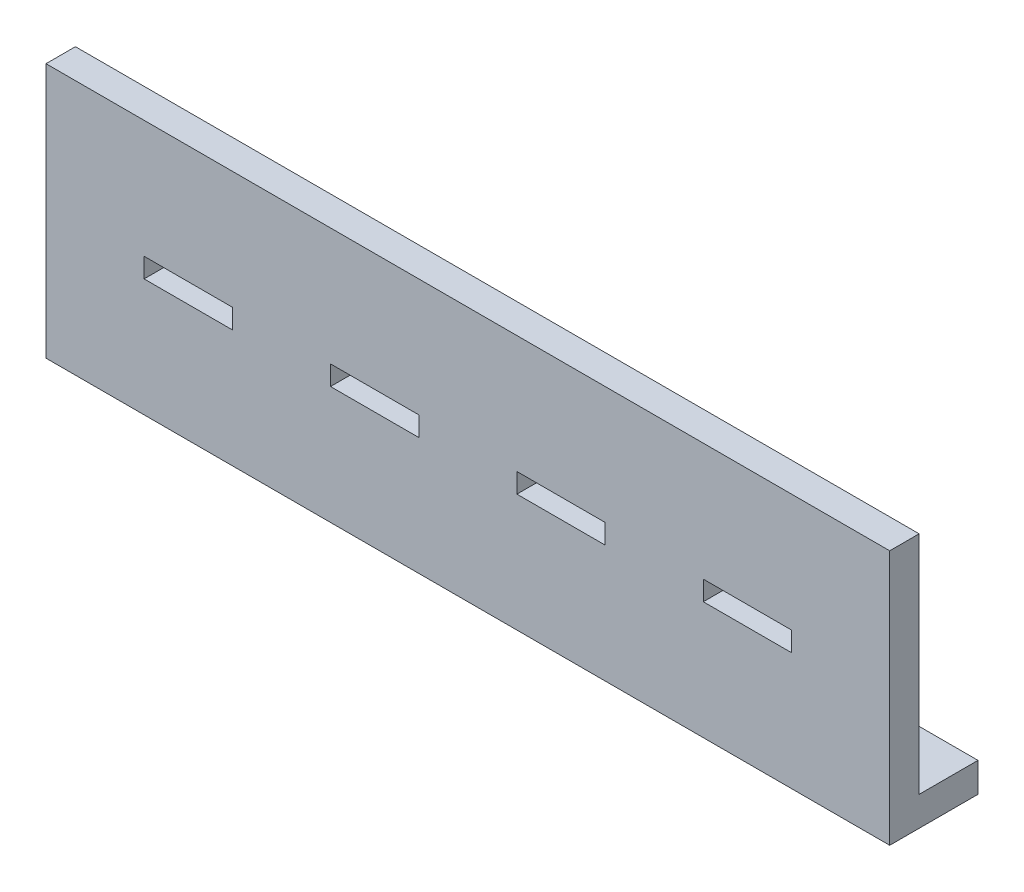
ISO-10303-21;
HEADER;
FILE_DESCRIPTION(('STEP AP214'),'2;1');
FILE_NAME('part.step','',(''),(''),'','','');
FILE_SCHEMA(('AUTOMOTIVE_DESIGN { 1 0 10303 214 1 1 1 1 }'));
ENDSEC;
DATA;
#1=APPLICATION_CONTEXT('core data for automotive mechanical design processes');
#2=APPLICATION_PROTOCOL_DEFINITION('international standard','automotive_design',2000,#1);
#3=PRODUCT_CONTEXT('',#1,'mechanical');
#4=PRODUCT('Part','Part','',(#3));
#5=PRODUCT_RELATED_PRODUCT_CATEGORY('part','',(#4));
#6=PRODUCT_DEFINITION_FORMATION('','',#4);
#7=PRODUCT_DEFINITION_CONTEXT('part definition',#1,'design');
#8=PRODUCT_DEFINITION('design','',#6,#7);
#9=PRODUCT_DEFINITION_SHAPE('','',#8);
#10=(LENGTH_UNIT() NAMED_UNIT(*) SI_UNIT(.MILLI.,.METRE.));
#11=(NAMED_UNIT(*) PLANE_ANGLE_UNIT() SI_UNIT($,.RADIAN.));
#12=(NAMED_UNIT(*) SI_UNIT($,.STERADIAN.) SOLID_ANGLE_UNIT());
#13=UNCERTAINTY_MEASURE_WITH_UNIT(LENGTH_MEASURE(1.E-05),#10,'distance_accuracy_value','');
#14=(GEOMETRIC_REPRESENTATION_CONTEXT(3) GLOBAL_UNCERTAINTY_ASSIGNED_CONTEXT((#13)) GLOBAL_UNIT_ASSIGNED_CONTEXT((#10,
#11,#12)) REPRESENTATION_CONTEXT('',''));
#15=CARTESIAN_POINT('',(0.,0.,0.));
#16=DIRECTION('',(0.,0.,1.));
#17=DIRECTION('',(1.,0.,0.));
#18=AXIS2_PLACEMENT_3D('',#15,#16,#17);
#19=CARTESIAN_POINT('',(0.,0.,1.5));
#20=DIRECTION('',(0.,0.,-1.));
#21=DIRECTION('',(-1.,0.,0.));
#22=AXIS2_PLACEMENT_3D('',#19,#20,#21);
#23=PLANE('',#22);
#24=DIRECTION('',(0.,-1.,0.));
#25=VECTOR('',#24,1.);
#26=CARTESIAN_POINT('',(48.,14.,1.5));
#27=LINE('',#26,#25);
#28=CARTESIAN_POINT('',(48.,14.,1.5));
#29=VERTEX_POINT('',#28);
#30=CARTESIAN_POINT('',(48.,12.,1.5));
#31=VERTEX_POINT('',#30);
#32=EDGE_CURVE('E240',#29,#31,#27,.T.);
#33=ORIENTED_EDGE('',*,*,#32,.F.);
#34=DIRECTION('',(-1.,0.,0.));
#35=VECTOR('',#34,1.);
#36=CARTESIAN_POINT('',(48.,14.,1.5));
#37=LINE('',#36,#35);
#38=CARTESIAN_POINT('',(57.,14.,1.5));
#39=VERTEX_POINT('',#38);
#40=EDGE_CURVE('E248',#39,#29,#37,.T.);
#41=ORIENTED_EDGE('',*,*,#40,.F.);
#42=DIRECTION('',(0.,1.,0.));
#43=VECTOR('',#42,1.);
#44=CARTESIAN_POINT('',(57.,14.,1.5));
#45=LINE('',#44,#43);
#46=CARTESIAN_POINT('',(57.,12.,1.5));
#47=VERTEX_POINT('',#46);
#48=EDGE_CURVE('E245',#47,#39,#45,.T.);
#49=ORIENTED_EDGE('',*,*,#48,.F.);
#50=DIRECTION('',(1.,0.,0.));
#51=VECTOR('',#50,1.);
#52=CARTESIAN_POINT('',(48.,12.,1.5));
#53=LINE('',#52,#51);
#54=EDGE_CURVE('E242',#31,#47,#53,.T.);
#55=ORIENTED_EDGE('',*,*,#54,.F.);
#56=EDGE_LOOP('',(#33,#41,#49,#55));
#57=FACE_BOUND('',#56,.T.);
#58=DIRECTION('',(0.,-1.,0.));
#59=VECTOR('',#58,1.);
#60=CARTESIAN_POINT('',(10.,14.,1.5));
#61=LINE('',#60,#59);
#62=CARTESIAN_POINT('',(10.,14.,1.5));
#63=VERTEX_POINT('',#62);
#64=CARTESIAN_POINT('',(10.,12.,1.5));
#65=VERTEX_POINT('',#64);
#66=EDGE_CURVE('E302',#63,#65,#61,.T.);
#67=ORIENTED_EDGE('',*,*,#66,.F.);
#68=DIRECTION('',(-1.,0.,0.));
#69=VECTOR('',#68,1.);
#70=CARTESIAN_POINT('',(10.,14.,1.5));
#71=LINE('',#70,#69);
#72=CARTESIAN_POINT('',(19.,14.,1.5));
#73=VERTEX_POINT('',#72);
#74=EDGE_CURVE('E310',#73,#63,#71,.T.);
#75=ORIENTED_EDGE('',*,*,#74,.F.);
#76=DIRECTION('',(0.,1.,0.));
#77=VECTOR('',#76,1.);
#78=CARTESIAN_POINT('',(19.,14.,1.5));
#79=LINE('',#78,#77);
#80=CARTESIAN_POINT('',(19.,12.,1.5));
#81=VERTEX_POINT('',#80);
#82=EDGE_CURVE('E307',#81,#73,#79,.T.);
#83=ORIENTED_EDGE('',*,*,#82,.F.);
#84=DIRECTION('',(1.,0.,0.));
#85=VECTOR('',#84,1.);
#86=CARTESIAN_POINT('',(10.,12.,1.5));
#87=LINE('',#86,#85);
#88=EDGE_CURVE('E304',#65,#81,#87,.T.);
#89=ORIENTED_EDGE('',*,*,#88,.F.);
#90=EDGE_LOOP('',(#67,#75,#83,#89));
#91=FACE_BOUND('',#90,.T.);
#92=DIRECTION('',(0.,-1.,0.));
#93=VECTOR('',#92,1.);
#94=CARTESIAN_POINT('',(0.,0.,1.5));
#95=LINE('',#94,#93);
#96=CARTESIAN_POINT('',(0.,26.,1.5));
#97=VERTEX_POINT('',#96);
#98=CARTESIAN_POINT('',(0.,0.,1.5));
#99=VERTEX_POINT('',#98);
#100=EDGE_CURVE('E333',#97,#99,#95,.T.);
#101=ORIENTED_EDGE('',*,*,#100,.T.);
#102=DIRECTION('',(1.,0.,0.));
#103=VECTOR('',#102,1.);
#104=CARTESIAN_POINT('',(0.,0.,1.5));
#105=LINE('',#104,#103);
#106=CARTESIAN_POINT('',(86.,0.,1.5));
#107=VERTEX_POINT('',#106);
#108=EDGE_CURVE('E336',#99,#107,#105,.T.);
#109=ORIENTED_EDGE('',*,*,#108,.T.);
#110=DIRECTION('',(0.,1.,0.));
#111=VECTOR('',#110,1.);
#112=CARTESIAN_POINT('',(86.,0.,1.5));
#113=LINE('',#112,#111);
#114=CARTESIAN_POINT('',(86.,26.,1.5));
#115=VERTEX_POINT('',#114);
#116=EDGE_CURVE('E339',#107,#115,#113,.T.);
#117=ORIENTED_EDGE('',*,*,#116,.T.);
#118=DIRECTION('',(-1.,0.,0.));
#119=VECTOR('',#118,1.);
#120=CARTESIAN_POINT('',(0.,26.,1.5));
#121=LINE('',#120,#119);
#122=EDGE_CURVE('E341',#115,#97,#121,.T.);
#123=ORIENTED_EDGE('',*,*,#122,.T.);
#124=EDGE_LOOP('',(#101,#109,#117,#123));
#125=FACE_BOUND('',#124,.T.);
#126=DIRECTION('',(0.,-1.,0.));
#127=VECTOR('',#126,1.);
#128=CARTESIAN_POINT('',(29.,14.,1.5));
#129=LINE('',#128,#127);
#130=CARTESIAN_POINT('',(29.,14.,1.5));
#131=VERTEX_POINT('',#130);
#132=CARTESIAN_POINT('',(29.,12.,1.5));
#133=VERTEX_POINT('',#132);
#134=EDGE_CURVE('E271',#131,#133,#129,.T.);
#135=ORIENTED_EDGE('',*,*,#134,.F.);
#136=DIRECTION('',(-1.,0.,0.));
#137=VECTOR('',#136,1.);
#138=CARTESIAN_POINT('',(29.,14.,1.5));
#139=LINE('',#138,#137);
#140=CARTESIAN_POINT('',(38.,14.,1.5));
#141=VERTEX_POINT('',#140);
#142=EDGE_CURVE('E279',#141,#131,#139,.T.);
#143=ORIENTED_EDGE('',*,*,#142,.F.);
#144=DIRECTION('',(0.,1.,0.));
#145=VECTOR('',#144,1.);
#146=CARTESIAN_POINT('',(38.,14.,1.5));
#147=LINE('',#146,#145);
#148=CARTESIAN_POINT('',(38.,12.,1.5));
#149=VERTEX_POINT('',#148);
#150=EDGE_CURVE('E276',#149,#141,#147,.T.);
#151=ORIENTED_EDGE('',*,*,#150,.F.);
#152=DIRECTION('',(1.,0.,0.));
#153=VECTOR('',#152,1.);
#154=CARTESIAN_POINT('',(29.,12.,1.5));
#155=LINE('',#154,#153);
#156=EDGE_CURVE('E273',#133,#149,#155,.T.);
#157=ORIENTED_EDGE('',*,*,#156,.F.);
#158=EDGE_LOOP('',(#135,#143,#151,#157));
#159=FACE_BOUND('',#158,.T.);
#160=DIRECTION('',(0.,-1.,0.));
#161=VECTOR('',#160,1.);
#162=CARTESIAN_POINT('',(67.,14.,1.5));
#163=LINE('',#162,#161);
#164=CARTESIAN_POINT('',(67.,14.,1.5));
#165=VERTEX_POINT('',#164);
#166=CARTESIAN_POINT('',(67.,12.,1.5));
#167=VERTEX_POINT('',#166);
#168=EDGE_CURVE('E214',#165,#167,#163,.T.);
#169=ORIENTED_EDGE('',*,*,#168,.F.);
#170=DIRECTION('',(-1.,0.,0.));
#171=VECTOR('',#170,1.);
#172=CARTESIAN_POINT('',(67.,14.,1.5));
#173=LINE('',#172,#171);
#174=CARTESIAN_POINT('',(76.,14.,1.5));
#175=VERTEX_POINT('',#174);
#176=EDGE_CURVE('E221',#175,#165,#173,.T.);
#177=ORIENTED_EDGE('',*,*,#176,.F.);
#178=DIRECTION('',(0.,1.,0.));
#179=VECTOR('',#178,1.);
#180=CARTESIAN_POINT('',(76.,14.,1.5));
#181=LINE('',#180,#179);
#182=CARTESIAN_POINT('',(76.,12.,1.5));
#183=VERTEX_POINT('',#182);
#184=EDGE_CURVE('E219',#183,#175,#181,.T.);
#185=ORIENTED_EDGE('',*,*,#184,.F.);
#186=DIRECTION('',(1.,0.,0.));
#187=VECTOR('',#186,1.);
#188=CARTESIAN_POINT('',(67.,12.,1.5));
#189=LINE('',#188,#187);
#190=EDGE_CURVE('E216',#167,#183,#189,.T.);
#191=ORIENTED_EDGE('',*,*,#190,.F.);
#192=EDGE_LOOP('',(#169,#177,#185,#191));
#193=FACE_BOUND('',#192,.T.);
#194=ADVANCED_FACE('F34',(#57,#91,#125,#159,#193),#23,.F.);
#195=CARTESIAN_POINT('',(0.,0.,-1.5));
#196=DIRECTION('',(0.,0.,-1.));
#197=DIRECTION('',(-1.,0.,0.));
#198=AXIS2_PLACEMENT_3D('',#195,#196,#197);
#199=PLANE('',#198);
#200=DIRECTION('',(1.,0.,0.));
#201=VECTOR('',#200,1.);
#202=CARTESIAN_POINT('',(0.,3.,-1.5));
#203=LINE('',#202,#201);
#204=CARTESIAN_POINT('',(0.,3.,-1.5));
#205=VERTEX_POINT('',#204);
#206=CARTESIAN_POINT('',(86.,3.,-1.5));
#207=VERTEX_POINT('',#206);
#208=EDGE_CURVE('E49',#205,#207,#203,.T.);
#209=ORIENTED_EDGE('',*,*,#208,.F.);
#210=DIRECTION('',(0.,-1.,0.));
#211=VECTOR('',#210,1.);
#212=CARTESIAN_POINT('',(0.,0.,-1.5));
#213=LINE('',#212,#211);
#214=CARTESIAN_POINT('',(0.,26.,-1.5));
#215=VERTEX_POINT('',#214);
#216=EDGE_CURVE('E332',#215,#205,#213,.T.);
#217=ORIENTED_EDGE('',*,*,#216,.F.);
#218=DIRECTION('',(-1.,0.,0.));
#219=VECTOR('',#218,1.);
#220=CARTESIAN_POINT('',(0.,26.,-1.5));
#221=LINE('',#220,#219);
#222=CARTESIAN_POINT('',(86.,26.,-1.5));
#223=VERTEX_POINT('',#222);
#224=EDGE_CURVE('E337',#223,#215,#221,.T.);
#225=ORIENTED_EDGE('',*,*,#224,.F.);
#226=DIRECTION('',(0.,1.,0.));
#227=VECTOR('',#226,1.);
#228=CARTESIAN_POINT('',(86.,0.,-1.5));
#229=LINE('',#228,#227);
#230=EDGE_CURVE('E345',#207,#223,#229,.T.);
#231=ORIENTED_EDGE('',*,*,#230,.F.);
#232=EDGE_LOOP('',(#209,#217,#225,#231));
#233=FACE_BOUND('',#232,.T.);
#234=DIRECTION('',(-1.,0.,0.));
#235=VECTOR('',#234,1.);
#236=CARTESIAN_POINT('',(10.,14.,-1.5));
#237=LINE('',#236,#235);
#238=CARTESIAN_POINT('',(19.,14.,-1.5));
#239=VERTEX_POINT('',#238);
#240=CARTESIAN_POINT('',(10.,14.,-1.5));
#241=VERTEX_POINT('',#240);
#242=EDGE_CURVE('E305',#239,#241,#237,.T.);
#243=ORIENTED_EDGE('',*,*,#242,.T.);
#244=DIRECTION('',(0.,-1.,0.));
#245=VECTOR('',#244,1.);
#246=CARTESIAN_POINT('',(10.,14.,-1.5));
#247=LINE('',#246,#245);
#248=CARTESIAN_POINT('',(10.,12.,-1.5));
#249=VERTEX_POINT('',#248);
#250=EDGE_CURVE('E301',#241,#249,#247,.T.);
#251=ORIENTED_EDGE('',*,*,#250,.T.);
#252=DIRECTION('',(1.,0.,0.));
#253=VECTOR('',#252,1.);
#254=CARTESIAN_POINT('',(10.,12.,-1.5));
#255=LINE('',#254,#253);
#256=CARTESIAN_POINT('',(19.,12.,-1.5));
#257=VERTEX_POINT('',#256);
#258=EDGE_CURVE('E315',#249,#257,#255,.T.);
#259=ORIENTED_EDGE('',*,*,#258,.T.);
#260=DIRECTION('',(0.,1.,0.));
#261=VECTOR('',#260,1.);
#262=CARTESIAN_POINT('',(19.,14.,-1.5));
#263=LINE('',#262,#261);
#264=EDGE_CURVE('E318',#257,#239,#263,.T.);
#265=ORIENTED_EDGE('',*,*,#264,.T.);
#266=EDGE_LOOP('',(#243,#251,#259,#265));
#267=FACE_BOUND('',#266,.T.);
#268=DIRECTION('',(-1.,0.,0.));
#269=VECTOR('',#268,1.);
#270=CARTESIAN_POINT('',(29.,14.,-1.5));
#271=LINE('',#270,#269);
#272=CARTESIAN_POINT('',(38.,14.,-1.5));
#273=VERTEX_POINT('',#272);
#274=CARTESIAN_POINT('',(29.,14.,-1.5));
#275=VERTEX_POINT('',#274);
#276=EDGE_CURVE('E274',#273,#275,#271,.T.);
#277=ORIENTED_EDGE('',*,*,#276,.T.);
#278=DIRECTION('',(0.,-1.,0.));
#279=VECTOR('',#278,1.);
#280=CARTESIAN_POINT('',(29.,14.,-1.5));
#281=LINE('',#280,#279);
#282=CARTESIAN_POINT('',(29.,12.,-1.5));
#283=VERTEX_POINT('',#282);
#284=EDGE_CURVE('E270',#275,#283,#281,.T.);
#285=ORIENTED_EDGE('',*,*,#284,.T.);
#286=DIRECTION('',(1.,0.,0.));
#287=VECTOR('',#286,1.);
#288=CARTESIAN_POINT('',(29.,12.,-1.5));
#289=LINE('',#288,#287);
#290=CARTESIAN_POINT('',(38.,12.,-1.5));
#291=VERTEX_POINT('',#290);
#292=EDGE_CURVE('E284',#283,#291,#289,.T.);
#293=ORIENTED_EDGE('',*,*,#292,.T.);
#294=DIRECTION('',(0.,1.,0.));
#295=VECTOR('',#294,1.);
#296=CARTESIAN_POINT('',(38.,14.,-1.5));
#297=LINE('',#296,#295);
#298=EDGE_CURVE('E287',#291,#273,#297,.T.);
#299=ORIENTED_EDGE('',*,*,#298,.T.);
#300=EDGE_LOOP('',(#277,#285,#293,#299));
#301=FACE_BOUND('',#300,.T.);
#302=DIRECTION('',(-1.,0.,0.));
#303=VECTOR('',#302,1.);
#304=CARTESIAN_POINT('',(48.,14.,-1.5));
#305=LINE('',#304,#303);
#306=CARTESIAN_POINT('',(57.,14.,-1.5));
#307=VERTEX_POINT('',#306);
#308=CARTESIAN_POINT('',(48.,14.,-1.5));
#309=VERTEX_POINT('',#308);
#310=EDGE_CURVE('E243',#307,#309,#305,.T.);
#311=ORIENTED_EDGE('',*,*,#310,.T.);
#312=DIRECTION('',(0.,-1.,0.));
#313=VECTOR('',#312,1.);
#314=CARTESIAN_POINT('',(48.,14.,-1.5));
#315=LINE('',#314,#313);
#316=CARTESIAN_POINT('',(48.,12.,-1.5));
#317=VERTEX_POINT('',#316);
#318=EDGE_CURVE('E239',#309,#317,#315,.T.);
#319=ORIENTED_EDGE('',*,*,#318,.T.);
#320=DIRECTION('',(1.,0.,0.));
#321=VECTOR('',#320,1.);
#322=CARTESIAN_POINT('',(48.,12.,-1.5));
#323=LINE('',#322,#321);
#324=CARTESIAN_POINT('',(57.,12.,-1.5));
#325=VERTEX_POINT('',#324);
#326=EDGE_CURVE('E253',#317,#325,#323,.T.);
#327=ORIENTED_EDGE('',*,*,#326,.T.);
#328=DIRECTION('',(0.,1.,0.));
#329=VECTOR('',#328,1.);
#330=CARTESIAN_POINT('',(57.,14.,-1.5));
#331=LINE('',#330,#329);
#332=EDGE_CURVE('E256',#325,#307,#331,.T.);
#333=ORIENTED_EDGE('',*,*,#332,.T.);
#334=EDGE_LOOP('',(#311,#319,#327,#333));
#335=FACE_BOUND('',#334,.T.);
#336=DIRECTION('',(-1.,0.,0.));
#337=VECTOR('',#336,1.);
#338=CARTESIAN_POINT('',(67.,14.,-1.5));
#339=LINE('',#338,#337);
#340=CARTESIAN_POINT('',(76.,14.,-1.5));
#341=VERTEX_POINT('',#340);
#342=CARTESIAN_POINT('',(67.,14.,-1.5));
#343=VERTEX_POINT('',#342);
#344=EDGE_CURVE('E217',#341,#343,#339,.T.);
#345=ORIENTED_EDGE('',*,*,#344,.T.);
#346=DIRECTION('',(0.,-1.,0.));
#347=VECTOR('',#346,1.);
#348=CARTESIAN_POINT('',(67.,14.,-1.5));
#349=LINE('',#348,#347);
#350=CARTESIAN_POINT('',(67.,12.,-1.5));
#351=VERTEX_POINT('',#350);
#352=EDGE_CURVE('E205',#343,#351,#349,.T.);
#353=ORIENTED_EDGE('',*,*,#352,.T.);
#354=DIRECTION('',(1.,0.,0.));
#355=VECTOR('',#354,1.);
#356=CARTESIAN_POINT('',(67.,12.,-1.5));
#357=LINE('',#356,#355);
#358=CARTESIAN_POINT('',(76.,12.,-1.5));
#359=VERTEX_POINT('',#358);
#360=EDGE_CURVE('E209',#351,#359,#357,.T.);
#361=ORIENTED_EDGE('',*,*,#360,.T.);
#362=DIRECTION('',(0.,1.,0.));
#363=VECTOR('',#362,1.);
#364=CARTESIAN_POINT('',(76.,14.,-1.5));
#365=LINE('',#364,#363);
#366=EDGE_CURVE('E226',#359,#341,#365,.T.);
#367=ORIENTED_EDGE('',*,*,#366,.T.);
#368=EDGE_LOOP('',(#345,#353,#361,#367));
#369=FACE_BOUND('',#368,.T.);
#370=ADVANCED_FACE('F358',(#233,#267,#301,#335,#369),#199,.T.);
#371=CARTESIAN_POINT('',(0.,0.,1.5));
#372=DIRECTION('',(1.,0.,0.));
#373=DIRECTION('',(0.,0.,-1.));
#374=AXIS2_PLACEMENT_3D('',#371,#372,#373);
#375=PLANE('',#374);
#376=ORIENTED_EDGE('',*,*,#216,.T.);
#377=DIRECTION('',(0.,0.,1.));
#378=VECTOR('',#377,1.);
#379=CARTESIAN_POINT('',(0.,3.,-7.5));
#380=LINE('',#379,#378);
#381=CARTESIAN_POINT('',(0.,3.,-7.5));
#382=VERTEX_POINT('',#381);
#383=EDGE_CURVE('E206',#382,#205,#380,.T.);
#384=ORIENTED_EDGE('',*,*,#383,.F.);
#385=DIRECTION('',(0.,1.,0.));
#386=VECTOR('',#385,1.);
#387=CARTESIAN_POINT('',(0.,0.,-7.5));
#388=LINE('',#387,#386);
#389=CARTESIAN_POINT('',(0.,0.,-7.5));
#390=VERTEX_POINT('',#389);
#391=EDGE_CURVE('E199',#390,#382,#388,.T.);
#392=ORIENTED_EDGE('',*,*,#391,.F.);
#393=DIRECTION('',(0.,0.,-1.));
#394=VECTOR('',#393,1.);
#395=CARTESIAN_POINT('',(0.,0.,1.5));
#396=LINE('',#395,#394);
#397=EDGE_CURVE('E11',#99,#390,#396,.T.);
#398=ORIENTED_EDGE('',*,*,#397,.F.);
#399=ORIENTED_EDGE('',*,*,#100,.F.);
#400=DIRECTION('',(0.,0.,-1.));
#401=VECTOR('',#400,1.);
#402=CARTESIAN_POINT('',(0.,26.,1.5));
#403=LINE('',#402,#401);
#404=EDGE_CURVE('E343',#97,#215,#403,.T.);
#405=ORIENTED_EDGE('',*,*,#404,.T.);
#406=EDGE_LOOP('',(#376,#384,#392,#398,#399,#405));
#407=FACE_BOUND('',#406,.T.);
#408=ADVANCED_FACE('F36',(#407),#375,.F.);
#409=CARTESIAN_POINT('',(0.,0.,1.5));
#410=DIRECTION('',(0.,1.,0.));
#411=DIRECTION('',(0.,0.,1.));
#412=AXIS2_PLACEMENT_3D('',#409,#410,#411);
#413=PLANE('',#412);
#414=CARTESIAN_POINT('',(10.,0.,-4.5));
#415=DIRECTION('',(0.,1.,0.));
#416=DIRECTION('',(0.,0.,1.));
#417=AXIS2_PLACEMENT_3D('',#414,#415,#416);
#418=CIRCLE('',#417,2.);
#419=CARTESIAN_POINT('',(10.,0.,-2.5));
#420=VERTEX_POINT('',#419);
#421=EDGE_CURVE('E369',#420,#420,#418,.T.);
#422=ORIENTED_EDGE('',*,*,#421,.T.);
#423=EDGE_LOOP('',(#422));
#424=FACE_BOUND('',#423,.T.);
#425=CARTESIAN_POINT('',(76.,0.,-4.5));
#426=DIRECTION('',(0.,1.,0.));
#427=DIRECTION('',(0.,0.,1.));
#428=AXIS2_PLACEMENT_3D('',#425,#426,#427);
#429=CIRCLE('',#428,2.);
#430=CARTESIAN_POINT('',(76.,0.,-2.5));
#431=VERTEX_POINT('',#430);
#432=EDGE_CURVE('E371',#431,#431,#429,.T.);
#433=ORIENTED_EDGE('',*,*,#432,.T.);
#434=EDGE_LOOP('',(#433));
#435=FACE_BOUND('',#434,.T.);
#436=ORIENTED_EDGE('',*,*,#397,.T.);
#437=DIRECTION('',(-1.,0.,0.));
#438=VECTOR('',#437,1.);
#439=CARTESIAN_POINT('',(86.,0.,-7.5));
#440=LINE('',#439,#438);
#441=CARTESIAN_POINT('',(86.,0.,-7.5));
#442=VERTEX_POINT('',#441);
#443=EDGE_CURVE('E193',#442,#390,#440,.T.);
#444=ORIENTED_EDGE('',*,*,#443,.F.);
#445=DIRECTION('',(0.,0.,-1.));
#446=VECTOR('',#445,1.);
#447=CARTESIAN_POINT('',(86.,0.,1.5));
#448=LINE('',#447,#446);
#449=EDGE_CURVE('E42',#107,#442,#448,.T.);
#450=ORIENTED_EDGE('',*,*,#449,.F.);
#451=ORIENTED_EDGE('',*,*,#108,.F.);
#452=EDGE_LOOP('',(#436,#444,#450,#451));
#453=FACE_BOUND('',#452,.T.);
#454=ADVANCED_FACE('F366',(#424,#435,#453),#413,.F.);
#455=CARTESIAN_POINT('',(86.,0.,1.5));
#456=DIRECTION('',(-1.,0.,0.));
#457=DIRECTION('',(0.,0.,1.));
#458=AXIS2_PLACEMENT_3D('',#455,#456,#457);
#459=PLANE('',#458);
#460=ORIENTED_EDGE('',*,*,#449,.T.);
#461=DIRECTION('',(0.,-1.,0.));
#462=VECTOR('',#461,1.);
#463=CARTESIAN_POINT('',(86.,3.,-7.5));
#464=LINE('',#463,#462);
#465=CARTESIAN_POINT('',(86.,3.,-7.5));
#466=VERTEX_POINT('',#465);
#467=EDGE_CURVE('E183',#466,#442,#464,.T.);
#468=ORIENTED_EDGE('',*,*,#467,.F.);
#469=DIRECTION('',(0.,0.,1.));
#470=VECTOR('',#469,1.);
#471=CARTESIAN_POINT('',(86.,3.,-7.5));
#472=LINE('',#471,#470);
#473=EDGE_CURVE('E187',#466,#207,#472,.T.);
#474=ORIENTED_EDGE('',*,*,#473,.T.);
#475=ORIENTED_EDGE('',*,*,#230,.T.);
#476=DIRECTION('',(0.,0.,-1.));
#477=VECTOR('',#476,1.);
#478=CARTESIAN_POINT('',(86.,26.,1.5));
#479=LINE('',#478,#477);
#480=EDGE_CURVE('E350',#115,#223,#479,.T.);
#481=ORIENTED_EDGE('',*,*,#480,.F.);
#482=ORIENTED_EDGE('',*,*,#116,.F.);
#483=EDGE_LOOP('',(#460,#468,#474,#475,#481,#482));
#484=FACE_BOUND('',#483,.T.);
#485=ADVANCED_FACE('F185',(#484),#459,.F.);
#486=CARTESIAN_POINT('',(0.,26.,1.5));
#487=DIRECTION('',(0.,-1.,0.));
#488=DIRECTION('',(0.,0.,-1.));
#489=AXIS2_PLACEMENT_3D('',#486,#487,#488);
#490=PLANE('',#489);
#491=ORIENTED_EDGE('',*,*,#224,.T.);
#492=ORIENTED_EDGE('',*,*,#404,.F.);
#493=ORIENTED_EDGE('',*,*,#122,.F.);
#494=ORIENTED_EDGE('',*,*,#480,.T.);
#495=EDGE_LOOP('',(#491,#492,#493,#494));
#496=FACE_BOUND('',#495,.T.);
#497=ADVANCED_FACE('F356',(#496),#490,.F.);
#498=CARTESIAN_POINT('',(10.,14.,1.5));
#499=DIRECTION('',(1.,0.,0.));
#500=DIRECTION('',(0.,0.,-1.));
#501=AXIS2_PLACEMENT_3D('',#498,#499,#500);
#502=PLANE('',#501);
#503=ORIENTED_EDGE('',*,*,#250,.F.);
#504=DIRECTION('',(0.,0.,-1.));
#505=VECTOR('',#504,1.);
#506=CARTESIAN_POINT('',(10.,14.,1.5));
#507=LINE('',#506,#505);
#508=EDGE_CURVE('E312',#63,#241,#507,.T.);
#509=ORIENTED_EDGE('',*,*,#508,.F.);
#510=ORIENTED_EDGE('',*,*,#66,.T.);
#511=DIRECTION('',(0.,0.,-1.));
#512=VECTOR('',#511,1.);
#513=CARTESIAN_POINT('',(10.,12.,1.5));
#514=LINE('',#513,#512);
#515=EDGE_CURVE('E329',#65,#249,#514,.T.);
#516=ORIENTED_EDGE('',*,*,#515,.T.);
#517=EDGE_LOOP('',(#503,#509,#510,#516));
#518=FACE_BOUND('',#517,.T.);
#519=ADVANCED_FACE('F416',(#518),#502,.T.);
#520=CARTESIAN_POINT('',(10.,12.,1.5));
#521=DIRECTION('',(0.,1.,0.));
#522=DIRECTION('',(0.,0.,1.));
#523=AXIS2_PLACEMENT_3D('',#520,#521,#522);
#524=PLANE('',#523);
#525=ORIENTED_EDGE('',*,*,#258,.F.);
#526=ORIENTED_EDGE('',*,*,#515,.F.);
#527=ORIENTED_EDGE('',*,*,#88,.T.);
#528=DIRECTION('',(0.,0.,-1.));
#529=VECTOR('',#528,1.);
#530=CARTESIAN_POINT('',(19.,12.,1.5));
#531=LINE('',#530,#529);
#532=EDGE_CURVE('E327',#81,#257,#531,.T.);
#533=ORIENTED_EDGE('',*,*,#532,.T.);
#534=EDGE_LOOP('',(#525,#526,#527,#533));
#535=FACE_BOUND('',#534,.T.);
#536=ADVANCED_FACE('F423',(#535),#524,.T.);
#537=CARTESIAN_POINT('',(19.,14.,1.5));
#538=DIRECTION('',(-1.,0.,0.));
#539=DIRECTION('',(0.,0.,1.));
#540=AXIS2_PLACEMENT_3D('',#537,#538,#539);
#541=PLANE('',#540);
#542=ORIENTED_EDGE('',*,*,#264,.F.);
#543=ORIENTED_EDGE('',*,*,#532,.F.);
#544=ORIENTED_EDGE('',*,*,#82,.T.);
#545=DIRECTION('',(0.,0.,-1.));
#546=VECTOR('',#545,1.);
#547=CARTESIAN_POINT('',(19.,14.,1.5));
#548=LINE('',#547,#546);
#549=EDGE_CURVE('E325',#73,#239,#548,.T.);
#550=ORIENTED_EDGE('',*,*,#549,.T.);
#551=EDGE_LOOP('',(#542,#543,#544,#550));
#552=FACE_BOUND('',#551,.T.);
#553=ADVANCED_FACE('F428',(#552),#541,.T.);
#554=CARTESIAN_POINT('',(10.,14.,1.5));
#555=DIRECTION('',(0.,-1.,0.));
#556=DIRECTION('',(0.,0.,-1.));
#557=AXIS2_PLACEMENT_3D('',#554,#555,#556);
#558=PLANE('',#557);
#559=ORIENTED_EDGE('',*,*,#242,.F.);
#560=ORIENTED_EDGE('',*,*,#549,.F.);
#561=ORIENTED_EDGE('',*,*,#74,.T.);
#562=ORIENTED_EDGE('',*,*,#508,.T.);
#563=EDGE_LOOP('',(#559,#560,#561,#562));
#564=FACE_BOUND('',#563,.T.);
#565=ADVANCED_FACE('F435',(#564),#558,.T.);
#566=CARTESIAN_POINT('',(29.,14.,1.5));
#567=DIRECTION('',(1.,0.,0.));
#568=DIRECTION('',(0.,1.,0.));
#569=AXIS2_PLACEMENT_3D('',#566,#567,#568);
#570=PLANE('',#569);
#571=ORIENTED_EDGE('',*,*,#284,.F.);
#572=DIRECTION('',(0.,0.,-1.));
#573=VECTOR('',#572,1.);
#574=CARTESIAN_POINT('',(29.,14.,1.5));
#575=LINE('',#574,#573);
#576=EDGE_CURVE('E281',#131,#275,#575,.T.);
#577=ORIENTED_EDGE('',*,*,#576,.F.);
#578=ORIENTED_EDGE('',*,*,#134,.T.);
#579=DIRECTION('',(0.,0.,-1.));
#580=VECTOR('',#579,1.);
#581=CARTESIAN_POINT('',(29.,12.,1.5));
#582=LINE('',#581,#580);
#583=EDGE_CURVE('E298',#133,#283,#582,.T.);
#584=ORIENTED_EDGE('',*,*,#583,.T.);
#585=EDGE_LOOP('',(#571,#577,#578,#584));
#586=FACE_BOUND('',#585,.T.);
#587=ADVANCED_FACE('F448',(#586),#570,.T.);
#588=CARTESIAN_POINT('',(29.,12.,1.5));
#589=DIRECTION('',(0.,1.,0.));
#590=DIRECTION('',(0.,0.,1.));
#591=AXIS2_PLACEMENT_3D('',#588,#589,#590);
#592=PLANE('',#591);
#593=ORIENTED_EDGE('',*,*,#292,.F.);
#594=ORIENTED_EDGE('',*,*,#583,.F.);
#595=ORIENTED_EDGE('',*,*,#156,.T.);
#596=DIRECTION('',(0.,0.,-1.));
#597=VECTOR('',#596,1.);
#598=CARTESIAN_POINT('',(38.,12.,1.5));
#599=LINE('',#598,#597);
#600=EDGE_CURVE('E296',#149,#291,#599,.T.);
#601=ORIENTED_EDGE('',*,*,#600,.T.);
#602=EDGE_LOOP('',(#593,#594,#595,#601));
#603=FACE_BOUND('',#602,.T.);
#604=ADVANCED_FACE('F453',(#603),#592,.T.);
#605=CARTESIAN_POINT('',(38.,14.,1.5));
#606=DIRECTION('',(-1.,0.,0.));
#607=DIRECTION('',(0.,0.,1.));
#608=AXIS2_PLACEMENT_3D('',#605,#606,#607);
#609=PLANE('',#608);
#610=ORIENTED_EDGE('',*,*,#298,.F.);
#611=ORIENTED_EDGE('',*,*,#600,.F.);
#612=ORIENTED_EDGE('',*,*,#150,.T.);
#613=DIRECTION('',(0.,0.,-1.));
#614=VECTOR('',#613,1.);
#615=CARTESIAN_POINT('',(38.,14.,1.5));
#616=LINE('',#615,#614);
#617=EDGE_CURVE('E294',#141,#273,#616,.T.);
#618=ORIENTED_EDGE('',*,*,#617,.T.);
#619=EDGE_LOOP('',(#610,#611,#612,#618));
#620=FACE_BOUND('',#619,.T.);
#621=ADVANCED_FACE('F457',(#620),#609,.T.);
#622=CARTESIAN_POINT('',(29.,14.,1.5));
#623=DIRECTION('',(0.,-1.,0.));
#624=DIRECTION('',(0.,0.,-1.));
#625=AXIS2_PLACEMENT_3D('',#622,#623,#624);
#626=PLANE('',#625);
#627=ORIENTED_EDGE('',*,*,#276,.F.);
#628=ORIENTED_EDGE('',*,*,#617,.F.);
#629=ORIENTED_EDGE('',*,*,#142,.T.);
#630=ORIENTED_EDGE('',*,*,#576,.T.);
#631=EDGE_LOOP('',(#627,#628,#629,#630));
#632=FACE_BOUND('',#631,.T.);
#633=ADVANCED_FACE('F461',(#632),#626,.T.);
#634=CARTESIAN_POINT('',(48.,14.,1.5));
#635=DIRECTION('',(1.,0.,0.));
#636=DIRECTION('',(0.,0.,-1.));
#637=AXIS2_PLACEMENT_3D('',#634,#635,#636);
#638=PLANE('',#637);
#639=ORIENTED_EDGE('',*,*,#318,.F.);
#640=DIRECTION('',(0.,0.,-1.));
#641=VECTOR('',#640,1.);
#642=CARTESIAN_POINT('',(48.,14.,1.5));
#643=LINE('',#642,#641);
#644=EDGE_CURVE('E250',#29,#309,#643,.T.);
#645=ORIENTED_EDGE('',*,*,#644,.F.);
#646=ORIENTED_EDGE('',*,*,#32,.T.);
#647=DIRECTION('',(0.,0.,-1.));
#648=VECTOR('',#647,1.);
#649=CARTESIAN_POINT('',(48.,12.,1.5));
#650=LINE('',#649,#648);
#651=EDGE_CURVE('E267',#31,#317,#650,.T.);
#652=ORIENTED_EDGE('',*,*,#651,.T.);
#653=EDGE_LOOP('',(#639,#645,#646,#652));
#654=FACE_BOUND('',#653,.T.);
#655=ADVANCED_FACE('F465',(#654),#638,.T.);
#656=CARTESIAN_POINT('',(48.,12.,1.5));
#657=DIRECTION('',(0.,1.,0.));
#658=DIRECTION('',(0.,0.,1.));
#659=AXIS2_PLACEMENT_3D('',#656,#657,#658);
#660=PLANE('',#659);
#661=ORIENTED_EDGE('',*,*,#326,.F.);
#662=ORIENTED_EDGE('',*,*,#651,.F.);
#663=ORIENTED_EDGE('',*,*,#54,.T.);
#664=DIRECTION('',(0.,0.,-1.));
#665=VECTOR('',#664,1.);
#666=CARTESIAN_POINT('',(57.,12.,1.5));
#667=LINE('',#666,#665);
#668=EDGE_CURVE('E265',#47,#325,#667,.T.);
#669=ORIENTED_EDGE('',*,*,#668,.T.);
#670=EDGE_LOOP('',(#661,#662,#663,#669));
#671=FACE_BOUND('',#670,.T.);
#672=ADVANCED_FACE('F469',(#671),#660,.T.);
#673=CARTESIAN_POINT('',(57.,14.,1.5));
#674=DIRECTION('',(-1.,0.,0.));
#675=DIRECTION('',(0.,0.,1.));
#676=AXIS2_PLACEMENT_3D('',#673,#674,#675);
#677=PLANE('',#676);
#678=ORIENTED_EDGE('',*,*,#332,.F.);
#679=ORIENTED_EDGE('',*,*,#668,.F.);
#680=ORIENTED_EDGE('',*,*,#48,.T.);
#681=DIRECTION('',(0.,0.,-1.));
#682=VECTOR('',#681,1.);
#683=CARTESIAN_POINT('',(57.,14.,1.5));
#684=LINE('',#683,#682);
#685=EDGE_CURVE('E263',#39,#307,#684,.T.);
#686=ORIENTED_EDGE('',*,*,#685,.T.);
#687=EDGE_LOOP('',(#678,#679,#680,#686));
#688=FACE_BOUND('',#687,.T.);
#689=ADVANCED_FACE('F473',(#688),#677,.T.);
#690=CARTESIAN_POINT('',(48.,14.,1.5));
#691=DIRECTION('',(0.,-1.,0.));
#692=DIRECTION('',(0.,0.,-1.));
#693=AXIS2_PLACEMENT_3D('',#690,#691,#692);
#694=PLANE('',#693);
#695=ORIENTED_EDGE('',*,*,#310,.F.);
#696=ORIENTED_EDGE('',*,*,#685,.F.);
#697=ORIENTED_EDGE('',*,*,#40,.T.);
#698=ORIENTED_EDGE('',*,*,#644,.T.);
#699=EDGE_LOOP('',(#695,#696,#697,#698));
#700=FACE_BOUND('',#699,.T.);
#701=ADVANCED_FACE('F477',(#700),#694,.T.);
#702=CARTESIAN_POINT('',(67.,14.,1.5));
#703=DIRECTION('',(1.,0.,0.));
#704=DIRECTION('',(0.,0.,-1.));
#705=AXIS2_PLACEMENT_3D('',#702,#703,#704);
#706=PLANE('',#705);
#707=ORIENTED_EDGE('',*,*,#352,.F.);
#708=DIRECTION('',(0.,0.,-1.));
#709=VECTOR('',#708,1.);
#710=CARTESIAN_POINT('',(67.,14.,1.5));
#711=LINE('',#710,#709);
#712=EDGE_CURVE('E222',#165,#343,#711,.T.);
#713=ORIENTED_EDGE('',*,*,#712,.F.);
#714=ORIENTED_EDGE('',*,*,#168,.T.);
#715=DIRECTION('',(0.,0.,-1.));
#716=VECTOR('',#715,1.);
#717=CARTESIAN_POINT('',(67.,12.,1.5));
#718=LINE('',#717,#716);
#719=EDGE_CURVE('E236',#167,#351,#718,.T.);
#720=ORIENTED_EDGE('',*,*,#719,.T.);
#721=EDGE_LOOP('',(#707,#713,#714,#720));
#722=FACE_BOUND('',#721,.T.);
#723=ADVANCED_FACE('F481',(#722),#706,.T.);
#724=CARTESIAN_POINT('',(67.,12.,1.5));
#725=DIRECTION('',(0.,1.,0.));
#726=DIRECTION('',(0.,0.,1.));
#727=AXIS2_PLACEMENT_3D('',#724,#725,#726);
#728=PLANE('',#727);
#729=ORIENTED_EDGE('',*,*,#360,.F.);
#730=ORIENTED_EDGE('',*,*,#719,.F.);
#731=ORIENTED_EDGE('',*,*,#190,.T.);
#732=DIRECTION('',(0.,0.,-1.));
#733=VECTOR('',#732,1.);
#734=CARTESIAN_POINT('',(76.,12.,1.5));
#735=LINE('',#734,#733);
#736=EDGE_CURVE('E234',#183,#359,#735,.T.);
#737=ORIENTED_EDGE('',*,*,#736,.T.);
#738=EDGE_LOOP('',(#729,#730,#731,#737));
#739=FACE_BOUND('',#738,.T.);
#740=ADVANCED_FACE('F485',(#739),#728,.T.);
#741=CARTESIAN_POINT('',(76.,14.,1.5));
#742=DIRECTION('',(-1.,0.,0.));
#743=DIRECTION('',(0.,0.,1.));
#744=AXIS2_PLACEMENT_3D('',#741,#742,#743);
#745=PLANE('',#744);
#746=ORIENTED_EDGE('',*,*,#366,.F.);
#747=ORIENTED_EDGE('',*,*,#736,.F.);
#748=ORIENTED_EDGE('',*,*,#184,.T.);
#749=DIRECTION('',(0.,0.,-1.));
#750=VECTOR('',#749,1.);
#751=CARTESIAN_POINT('',(76.,14.,1.5));
#752=LINE('',#751,#750);
#753=EDGE_CURVE('E57',#175,#341,#752,.T.);
#754=ORIENTED_EDGE('',*,*,#753,.T.);
#755=EDGE_LOOP('',(#746,#747,#748,#754));
#756=FACE_BOUND('',#755,.T.);
#757=ADVANCED_FACE('F489',(#756),#745,.T.);
#758=CARTESIAN_POINT('',(67.,14.,1.5));
#759=DIRECTION('',(0.,-1.,0.));
#760=DIRECTION('',(0.,0.,-1.));
#761=AXIS2_PLACEMENT_3D('',#758,#759,#760);
#762=PLANE('',#761);
#763=ORIENTED_EDGE('',*,*,#344,.F.);
#764=ORIENTED_EDGE('',*,*,#753,.F.);
#765=ORIENTED_EDGE('',*,*,#176,.T.);
#766=ORIENTED_EDGE('',*,*,#712,.T.);
#767=EDGE_LOOP('',(#763,#764,#765,#766));
#768=FACE_BOUND('',#767,.T.);
#769=ADVANCED_FACE('F390',(#768),#762,.T.);
#770=CARTESIAN_POINT('',(0.,3.,-7.5));
#771=DIRECTION('',(0.,-1.,0.));
#772=DIRECTION('',(0.,0.,-1.));
#773=AXIS2_PLACEMENT_3D('',#770,#771,#772);
#774=PLANE('',#773);
#775=CARTESIAN_POINT('',(10.,3.,-4.5));
#776=DIRECTION('',(0.,1.,0.));
#777=DIRECTION('',(0.,0.,1.));
#778=AXIS2_PLACEMENT_3D('',#775,#776,#777);
#779=CIRCLE('',#778,2.);
#780=CARTESIAN_POINT('',(10.,3.,-2.5));
#781=VERTEX_POINT('',#780);
#782=EDGE_CURVE('E376',#781,#781,#779,.T.);
#783=ORIENTED_EDGE('',*,*,#782,.F.);
#784=EDGE_LOOP('',(#783));
#785=FACE_BOUND('',#784,.T.);
#786=CARTESIAN_POINT('',(76.,3.,-4.5));
#787=DIRECTION('',(0.,1.,0.));
#788=DIRECTION('',(0.,0.,1.));
#789=AXIS2_PLACEMENT_3D('',#786,#787,#788);
#790=CIRCLE('',#789,2.);
#791=CARTESIAN_POINT('',(76.,3.,-2.5));
#792=VERTEX_POINT('',#791);
#793=EDGE_CURVE('E379',#792,#792,#790,.T.);
#794=ORIENTED_EDGE('',*,*,#793,.F.);
#795=EDGE_LOOP('',(#794));
#796=FACE_BOUND('',#795,.T.);
#797=ORIENTED_EDGE('',*,*,#208,.T.);
#798=ORIENTED_EDGE('',*,*,#473,.F.);
#799=DIRECTION('',(1.,0.,0.));
#800=VECTOR('',#799,1.);
#801=CARTESIAN_POINT('',(0.,3.,-7.5));
#802=LINE('',#801,#800);
#803=EDGE_CURVE('E194',#382,#466,#802,.T.);
#804=ORIENTED_EDGE('',*,*,#803,.F.);
#805=ORIENTED_EDGE('',*,*,#383,.T.);
#806=EDGE_LOOP('',(#797,#798,#804,#805));
#807=FACE_BOUND('',#806,.T.);
#808=ADVANCED_FACE('F204',(#785,#796,#807),#774,.F.);
#809=CARTESIAN_POINT('',(0.,0.,-7.5));
#810=DIRECTION('',(0.,0.,-1.));
#811=DIRECTION('',(-1.,0.,0.));
#812=AXIS2_PLACEMENT_3D('',#809,#810,#811);
#813=PLANE('',#812);
#814=ORIENTED_EDGE('',*,*,#803,.T.);
#815=ORIENTED_EDGE('',*,*,#467,.T.);
#816=ORIENTED_EDGE('',*,*,#443,.T.);
#817=ORIENTED_EDGE('',*,*,#391,.T.);
#818=EDGE_LOOP('',(#814,#815,#816,#817));
#819=FACE_BOUND('',#818,.T.);
#820=ADVANCED_FACE('F197',(#819),#813,.T.);
#821=CARTESIAN_POINT('',(76.,-3.,-4.5));
#822=DIRECTION('',(0.,1.,0.));
#823=DIRECTION('',(0.,0.,1.));
#824=AXIS2_PLACEMENT_3D('',#821,#822,#823);
#825=CYLINDRICAL_SURFACE('',#824,2.);
#826=ORIENTED_EDGE('',*,*,#793,.T.);
#827=EDGE_LOOP('',(#826));
#828=FACE_BOUND('',#827,.T.);
#829=ORIENTED_EDGE('',*,*,#432,.F.);
#830=EDGE_LOOP('',(#829));
#831=FACE_BOUND('',#830,.T.);
#832=ADVANCED_FACE('F394',(#828,#831),#825,.F.);
#833=CARTESIAN_POINT('',(10.,-3.,-4.5));
#834=DIRECTION('',(0.,1.,0.));
#835=DIRECTION('',(0.,0.,1.));
#836=AXIS2_PLACEMENT_3D('',#833,#834,#835);
#837=CYLINDRICAL_SURFACE('',#836,2.);
#838=ORIENTED_EDGE('',*,*,#782,.T.);
#839=EDGE_LOOP('',(#838));
#840=FACE_BOUND('',#839,.T.);
#841=ORIENTED_EDGE('',*,*,#421,.F.);
#842=EDGE_LOOP('',(#841));
#843=FACE_BOUND('',#842,.T.);
#844=ADVANCED_FACE('F385',(#840,#843),#837,.F.);
#845=CLOSED_SHELL('',(#194,#370,#408,#454,#485,#497,#519,#536,#553,#565,#587,#604,#621,#633,
#655,#672,#689,#701,#723,#740,#757,#769,#808,#820,#832,#844));
#846=MANIFOLD_SOLID_BREP('B2',#845);
#847=ADVANCED_BREP_SHAPE_REPRESENTATION('',(#18,#846),#14);
#848=SHAPE_DEFINITION_REPRESENTATION(#9,#847);
ENDSEC;
END-ISO-10303-21;
